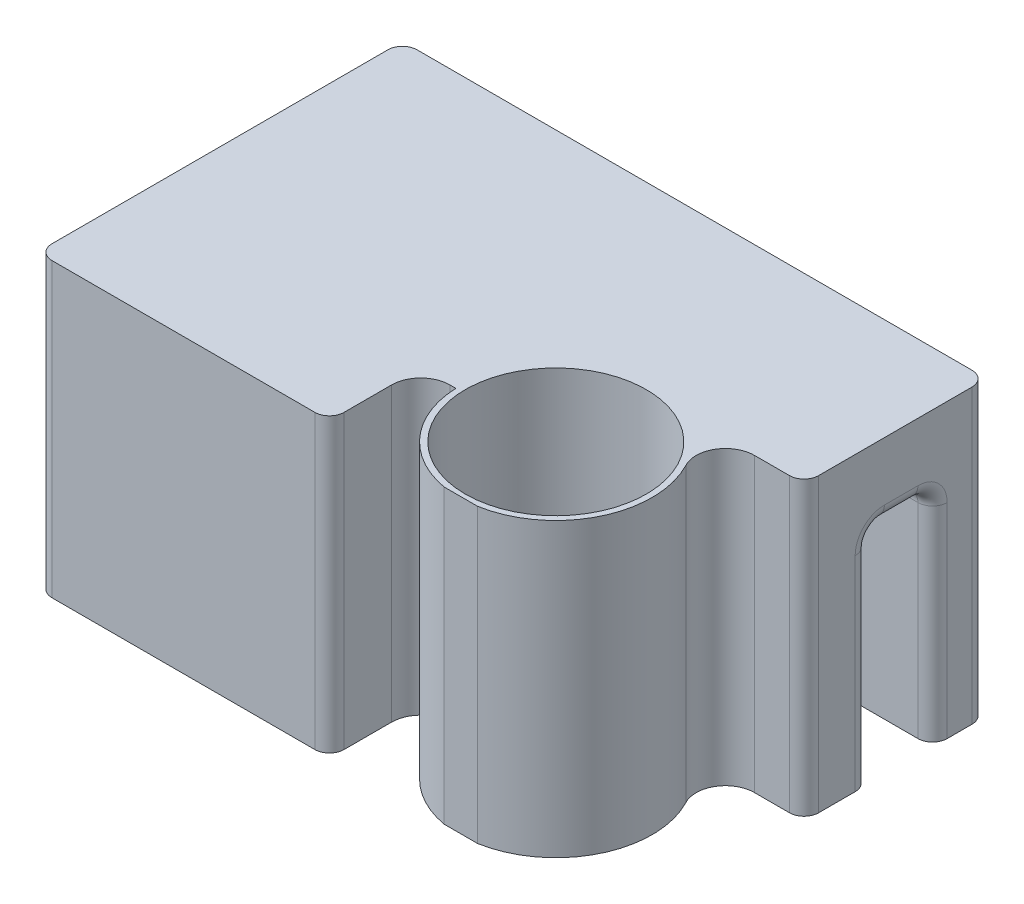
ISO-10303-21;
HEADER;
FILE_DESCRIPTION(('STEP AP214'),'2;1');
FILE_NAME('part.step','',(''),(''),'','','');
FILE_SCHEMA(('AUTOMOTIVE_DESIGN { 1 0 10303 214 1 1 1 1 }'));
ENDSEC;
DATA;
#1=APPLICATION_CONTEXT('core data for automotive mechanical design processes');
#2=APPLICATION_PROTOCOL_DEFINITION('international standard','automotive_design',2000,#1);
#3=PRODUCT_CONTEXT('',#1,'mechanical');
#4=PRODUCT('Part','Part','',(#3));
#5=PRODUCT_RELATED_PRODUCT_CATEGORY('part','',(#4));
#6=PRODUCT_DEFINITION_FORMATION('','',#4);
#7=PRODUCT_DEFINITION_CONTEXT('part definition',#1,'design');
#8=PRODUCT_DEFINITION('design','',#6,#7);
#9=PRODUCT_DEFINITION_SHAPE('','',#8);
#10=(LENGTH_UNIT() NAMED_UNIT(*) SI_UNIT(.MILLI.,.METRE.));
#11=(NAMED_UNIT(*) PLANE_ANGLE_UNIT() SI_UNIT($,.RADIAN.));
#12=(NAMED_UNIT(*) SI_UNIT($,.STERADIAN.) SOLID_ANGLE_UNIT());
#13=UNCERTAINTY_MEASURE_WITH_UNIT(LENGTH_MEASURE(1.E-05),#10,'distance_accuracy_value','');
#14=(GEOMETRIC_REPRESENTATION_CONTEXT(3) GLOBAL_UNCERTAINTY_ASSIGNED_CONTEXT((#13)) GLOBAL_UNIT_ASSIGNED_CONTEXT((#10,
#11,#12)) REPRESENTATION_CONTEXT('',''));
#15=CARTESIAN_POINT('',(0.,0.,0.));
#16=DIRECTION('',(0.,0.,1.));
#17=DIRECTION('',(1.,0.,0.));
#18=AXIS2_PLACEMENT_3D('',#15,#16,#17);
#19=CARTESIAN_POINT('',(20.,20.,12.5));
#20=DIRECTION('',(-1.,0.,0.));
#21=DIRECTION('',(0.,0.,1.));
#22=AXIS2_PLACEMENT_3D('',#19,#20,#21);
#23=PLANE('',#22);
#24=DIRECTION('',(0.,0.,-1.));
#25=VECTOR('',#24,1.);
#26=CARTESIAN_POINT('',(20.,16.,-9.8));
#27=LINE('',#26,#25);
#28=CARTESIAN_POINT('',(20.,16.,-5.5));
#29=VERTEX_POINT('',#28);
#30=CARTESIAN_POINT('',(20.,16.,-7.8));
#31=VERTEX_POINT('',#30);
#32=EDGE_CURVE('E502',#29,#31,#27,.T.);
#33=ORIENTED_EDGE('',*,*,#32,.T.);
#34=CARTESIAN_POINT('',(20.,14.,-7.8));
#35=DIRECTION('',(-1.,0.,0.));
#36=DIRECTION('',(0.,0.,1.));
#37=AXIS2_PLACEMENT_3D('',#34,#35,#36);
#38=CIRCLE('',#37,2.);
#39=CARTESIAN_POINT('',(20.,14.,-9.8));
#40=VERTEX_POINT('',#39);
#41=EDGE_CURVE('E56',#31,#40,#38,.T.);
#42=ORIENTED_EDGE('',*,*,#41,.T.);
#43=DIRECTION('',(0.,-1.,0.));
#44=VECTOR('',#43,1.);
#45=CARTESIAN_POINT('',(20.,20.,-9.8));
#46=LINE('',#45,#44);
#47=CARTESIAN_POINT('',(20.,0.,-9.8));
#48=VERTEX_POINT('',#47);
#49=EDGE_CURVE('E458',#40,#48,#46,.T.);
#50=ORIENTED_EDGE('',*,*,#49,.T.);
#51=DIRECTION('',(0.,0.,-1.));
#52=VECTOR('',#51,1.);
#53=CARTESIAN_POINT('',(20.,0.,12.5));
#54=LINE('',#53,#52);
#55=CARTESIAN_POINT('',(20.,0.,-11.5));
#56=VERTEX_POINT('',#55);
#57=EDGE_CURVE('E322',#48,#56,#54,.T.);
#58=ORIENTED_EDGE('',*,*,#57,.T.);
#59=DIRECTION('',(0.,-1.,0.));
#60=VECTOR('',#59,1.);
#61=CARTESIAN_POINT('',(20.,20.,-11.5));
#62=LINE('',#61,#60);
#63=CARTESIAN_POINT('',(20.,20.,-11.5));
#64=VERTEX_POINT('',#63);
#65=EDGE_CURVE('E460',#56,#64,#62,.F.);
#66=ORIENTED_EDGE('',*,*,#65,.T.);
#67=DIRECTION('',(0.,0.,-1.));
#68=VECTOR('',#67,1.);
#69=CARTESIAN_POINT('',(20.,20.,12.5));
#70=LINE('',#69,#68);
#71=CARTESIAN_POINT('',(20.,20.,-1.));
#72=VERTEX_POINT('',#71);
#73=EDGE_CURVE('E324',#72,#64,#70,.T.);
#74=ORIENTED_EDGE('',*,*,#73,.F.);
#75=DIRECTION('',(0.,1.,0.));
#76=VECTOR('',#75,1.);
#77=CARTESIAN_POINT('',(20.,0.,-1.));
#78=LINE('',#77,#76);
#79=CARTESIAN_POINT('',(20.,0.,-1.));
#80=VERTEX_POINT('',#79);
#81=EDGE_CURVE('E470',#72,#80,#78,.F.);
#82=ORIENTED_EDGE('',*,*,#81,.T.);
#83=CARTESIAN_POINT('',(20.,0.,-3.5));
#84=VERTEX_POINT('',#83);
#85=EDGE_CURVE('E344',#80,#84,#54,.T.);
#86=ORIENTED_EDGE('',*,*,#85,.T.);
#87=DIRECTION('',(0.,-1.,0.));
#88=VECTOR('',#87,1.);
#89=CARTESIAN_POINT('',(20.,20.,-3.5));
#90=LINE('',#89,#88);
#91=CARTESIAN_POINT('',(20.,14.,-3.5));
#92=VERTEX_POINT('',#91);
#93=EDGE_CURVE('E463',#84,#92,#90,.F.);
#94=ORIENTED_EDGE('',*,*,#93,.T.);
#95=CARTESIAN_POINT('',(20.,14.,-5.5));
#96=DIRECTION('',(-1.,0.,0.));
#97=DIRECTION('',(0.,0.,1.));
#98=AXIS2_PLACEMENT_3D('',#95,#96,#97);
#99=CIRCLE('',#98,2.);
#100=EDGE_CURVE('E522',#92,#29,#99,.T.);
#101=ORIENTED_EDGE('',*,*,#100,.T.);
#102=EDGE_LOOP('',(#33,#42,#50,#58,#66,#74,#82,#86,#94,#101));
#103=FACE_BOUND('',#102,.T.);
#104=ADVANCED_FACE('F47',(#103),#23,.F.);
#105=CARTESIAN_POINT('',(-20.,20.,12.5));
#106=DIRECTION('',(0.,0.,-1.));
#107=DIRECTION('',(-1.,0.,0.));
#108=AXIS2_PLACEMENT_3D('',#105,#106,#107);
#109=PLANE('',#108);
#110=DIRECTION('',(0.,1.,0.));
#111=VECTOR('',#110,1.);
#112=CARTESIAN_POINT('',(7.85544768577403,0.,12.5));
#113=LINE('',#112,#111);
#114=CARTESIAN_POINT('',(7.85544768577403,0.,12.5));
#115=VERTEX_POINT('',#114);
#116=CARTESIAN_POINT('',(7.85544768577403,20.,12.5));
#117=VERTEX_POINT('',#116);
#118=EDGE_CURVE('E262',#115,#117,#113,.T.);
#119=ORIENTED_EDGE('',*,*,#118,.F.);
#120=DIRECTION('',(1.,0.,0.));
#121=VECTOR('',#120,1.);
#122=CARTESIAN_POINT('',(-20.,0.,12.5));
#123=LINE('',#122,#121);
#124=CARTESIAN_POINT('',(10.144552314226,0.,12.5));
#125=VERTEX_POINT('',#124);
#126=EDGE_CURVE('E275',#115,#125,#123,.T.);
#127=ORIENTED_EDGE('',*,*,#126,.T.);
#128=DIRECTION('',(0.,1.,0.));
#129=VECTOR('',#128,1.);
#130=CARTESIAN_POINT('',(10.144552314226,0.,12.5));
#131=LINE('',#130,#129);
#132=CARTESIAN_POINT('',(10.144552314226,20.,12.5));
#133=VERTEX_POINT('',#132);
#134=EDGE_CURVE('E284',#125,#133,#131,.T.);
#135=ORIENTED_EDGE('',*,*,#134,.T.);
#136=DIRECTION('',(1.,0.,0.));
#137=VECTOR('',#136,1.);
#138=CARTESIAN_POINT('',(-20.,20.,12.5));
#139=LINE('',#138,#137);
#140=EDGE_CURVE('E338',#117,#133,#139,.T.);
#141=ORIENTED_EDGE('',*,*,#140,.F.);
#142=EDGE_LOOP('',(#119,#127,#135,#141));
#143=FACE_BOUND('',#142,.T.);
#144=ADVANCED_FACE('F596',(#143),#109,.F.);
#145=CARTESIAN_POINT('',(0.,0.,0.));
#146=DIRECTION('',(0.,-1.,0.));
#147=DIRECTION('',(0.,0.,-1.));
#148=AXIS2_PLACEMENT_3D('',#145,#146,#147);
#149=PLANE('',#148);
#150=DIRECTION('',(1.,0.,0.));
#151=VECTOR('',#150,1.);
#152=CARTESIAN_POINT('',(-20.,0.,-8.8));
#153=LINE('',#152,#151);
#154=CARTESIAN_POINT('',(-19.,0.,-8.8));
#155=VERTEX_POINT('',#154);
#156=CARTESIAN_POINT('',(19.,0.,-8.8));
#157=VERTEX_POINT('',#156);
#158=EDGE_CURVE('E311',#155,#157,#153,.T.);
#159=ORIENTED_EDGE('',*,*,#158,.F.);
#160=CARTESIAN_POINT('',(-19.,0.,-9.8));
#161=DIRECTION('',(0.,-1.,0.));
#162=DIRECTION('',(0.,0.,-1.));
#163=AXIS2_PLACEMENT_3D('',#160,#161,#162);
#164=CIRCLE('',#163,1.);
#165=CARTESIAN_POINT('',(-20.,0.,-9.8));
#166=VERTEX_POINT('',#165);
#167=EDGE_CURVE('E397',#155,#166,#164,.T.);
#168=ORIENTED_EDGE('',*,*,#167,.T.);
#169=DIRECTION('',(0.,0.,1.));
#170=VECTOR('',#169,1.);
#171=CARTESIAN_POINT('',(-20.,0.,12.5));
#172=LINE('',#171,#170);
#173=CARTESIAN_POINT('',(-20.,0.,-11.5));
#174=VERTEX_POINT('',#173);
#175=EDGE_CURVE('E358',#174,#166,#172,.T.);
#176=ORIENTED_EDGE('',*,*,#175,.F.);
#177=CARTESIAN_POINT('',(-19.,0.,-11.5));
#178=DIRECTION('',(0.,-1.,0.));
#179=DIRECTION('',(0.,0.,-1.));
#180=AXIS2_PLACEMENT_3D('',#177,#178,#179);
#181=CIRCLE('',#180,1.);
#182=CARTESIAN_POINT('',(-19.,0.,-12.5));
#183=VERTEX_POINT('',#182);
#184=EDGE_CURVE('E392',#174,#183,#181,.T.);
#185=ORIENTED_EDGE('',*,*,#184,.T.);
#186=DIRECTION('',(-1.,0.,0.));
#187=VECTOR('',#186,1.);
#188=CARTESIAN_POINT('',(-20.,0.,-12.5));
#189=LINE('',#188,#187);
#190=CARTESIAN_POINT('',(19.,0.,-12.5));
#191=VERTEX_POINT('',#190);
#192=EDGE_CURVE('E346',#191,#183,#189,.T.);
#193=ORIENTED_EDGE('',*,*,#192,.F.);
#194=CARTESIAN_POINT('',(19.,0.,-11.5));
#195=DIRECTION('',(0.,-1.,0.));
#196=DIRECTION('',(0.,0.,-1.));
#197=AXIS2_PLACEMENT_3D('',#194,#195,#196);
#198=CIRCLE('',#197,1.);
#199=EDGE_CURVE('E394',#191,#56,#198,.T.);
#200=ORIENTED_EDGE('',*,*,#199,.T.);
#201=ORIENTED_EDGE('',*,*,#57,.F.);
#202=CARTESIAN_POINT('',(19.,0.,-9.8));
#203=DIRECTION('',(0.,-1.,0.));
#204=DIRECTION('',(0.,0.,-1.));
#205=AXIS2_PLACEMENT_3D('',#202,#203,#204);
#206=CIRCLE('',#205,1.);
#207=EDGE_CURVE('E400',#48,#157,#206,.T.);
#208=ORIENTED_EDGE('',*,*,#207,.T.);
#209=EDGE_LOOP('',(#159,#168,#176,#185,#193,#200,#201,#208));
#210=FACE_BOUND('',#209,.T.);
#211=ADVANCED_FACE('F582',(#210),#149,.T.);
#212=CARTESIAN_POINT('',(-20.,20.,12.5));
#213=DIRECTION('',(1.,0.,0.));
#214=DIRECTION('',(0.,0.,-1.));
#215=AXIS2_PLACEMENT_3D('',#212,#213,#214);
#216=PLANE('',#215);
#217=DIRECTION('',(0.,0.,1.));
#218=VECTOR('',#217,1.);
#219=CARTESIAN_POINT('',(-20.,16.,-3.5));
#220=LINE('',#219,#218);
#221=CARTESIAN_POINT('',(-20.,16.,-7.8));
#222=VERTEX_POINT('',#221);
#223=CARTESIAN_POINT('',(-20.,16.,-5.50000000000001));
#224=VERTEX_POINT('',#223);
#225=EDGE_CURVE('E68',#222,#224,#220,.T.);
#226=ORIENTED_EDGE('',*,*,#225,.T.);
#227=CARTESIAN_POINT('',(-20.,14.,-5.50000000000001));
#228=DIRECTION('',(1.,0.,0.));
#229=DIRECTION('',(0.,0.,-1.));
#230=AXIS2_PLACEMENT_3D('',#227,#228,#229);
#231=CIRCLE('',#230,2.);
#232=CARTESIAN_POINT('',(-20.,14.,-3.5));
#233=VERTEX_POINT('',#232);
#234=EDGE_CURVE('E12',#224,#233,#231,.T.);
#235=ORIENTED_EDGE('',*,*,#234,.T.);
#236=DIRECTION('',(0.,-1.,0.));
#237=VECTOR('',#236,1.);
#238=CARTESIAN_POINT('',(-20.,20.,-3.5));
#239=LINE('',#238,#237);
#240=CARTESIAN_POINT('',(-20.,0.,-3.5));
#241=VERTEX_POINT('',#240);
#242=EDGE_CURVE('E406',#233,#241,#239,.T.);
#243=ORIENTED_EDGE('',*,*,#242,.T.);
#244=CARTESIAN_POINT('',(-20.,0.,11.5));
#245=VERTEX_POINT('',#244);
#246=EDGE_CURVE('E355',#241,#245,#172,.T.);
#247=ORIENTED_EDGE('',*,*,#246,.T.);
#248=DIRECTION('',(0.,-1.,0.));
#249=VECTOR('',#248,1.);
#250=CARTESIAN_POINT('',(-20.,20.,11.5));
#251=LINE('',#250,#249);
#252=CARTESIAN_POINT('',(-20.,20.,11.5));
#253=VERTEX_POINT('',#252);
#254=EDGE_CURVE('E401',#245,#253,#251,.F.);
#255=ORIENTED_EDGE('',*,*,#254,.T.);
#256=DIRECTION('',(0.,0.,1.));
#257=VECTOR('',#256,1.);
#258=CARTESIAN_POINT('',(-20.,20.,12.5));
#259=LINE('',#258,#257);
#260=CARTESIAN_POINT('',(-20.,20.,-11.5));
#261=VERTEX_POINT('',#260);
#262=EDGE_CURVE('E331',#261,#253,#259,.T.);
#263=ORIENTED_EDGE('',*,*,#262,.F.);
#264=DIRECTION('',(0.,-1.,0.));
#265=VECTOR('',#264,1.);
#266=CARTESIAN_POINT('',(-20.,20.,-11.5));
#267=LINE('',#266,#265);
#268=EDGE_CURVE('E407',#261,#174,#267,.T.);
#269=ORIENTED_EDGE('',*,*,#268,.T.);
#270=ORIENTED_EDGE('',*,*,#175,.T.);
#271=DIRECTION('',(0.,-1.,0.));
#272=VECTOR('',#271,1.);
#273=CARTESIAN_POINT('',(-20.,20.,-9.8));
#274=LINE('',#273,#272);
#275=CARTESIAN_POINT('',(-20.,14.,-9.8));
#276=VERTEX_POINT('',#275);
#277=EDGE_CURVE('E411',#166,#276,#274,.F.);
#278=ORIENTED_EDGE('',*,*,#277,.T.);
#279=CARTESIAN_POINT('',(-20.,14.,-7.8));
#280=DIRECTION('',(1.,0.,0.));
#281=DIRECTION('',(0.,0.,-1.));
#282=AXIS2_PLACEMENT_3D('',#279,#280,#281);
#283=CIRCLE('',#282,2.);
#284=EDGE_CURVE('E72',#276,#222,#283,.T.);
#285=ORIENTED_EDGE('',*,*,#284,.T.);
#286=EDGE_LOOP('',(#226,#235,#243,#247,#255,#263,#269,#270,#278,#285));
#287=FACE_BOUND('',#286,.T.);
#288=ADVANCED_FACE('F629',(#287),#216,.F.);
#289=CARTESIAN_POINT('',(-20.,20.,-12.5));
#290=DIRECTION('',(0.,0.,1.));
#291=DIRECTION('',(1.,0.,0.));
#292=AXIS2_PLACEMENT_3D('',#289,#290,#291);
#293=PLANE('',#292);
#294=DIRECTION('',(-1.,0.,0.));
#295=VECTOR('',#294,1.);
#296=CARTESIAN_POINT('',(-20.,20.,-12.5));
#297=LINE('',#296,#295);
#298=CARTESIAN_POINT('',(19.,20.,-12.5));
#299=VERTEX_POINT('',#298);
#300=CARTESIAN_POINT('',(-19.,20.,-12.5));
#301=VERTEX_POINT('',#300);
#302=EDGE_CURVE('E328',#299,#301,#297,.T.);
#303=ORIENTED_EDGE('',*,*,#302,.F.);
#304=DIRECTION('',(0.,-1.,0.));
#305=VECTOR('',#304,1.);
#306=CARTESIAN_POINT('',(19.,20.,-12.5));
#307=LINE('',#306,#305);
#308=EDGE_CURVE('E471',#299,#191,#307,.T.);
#309=ORIENTED_EDGE('',*,*,#308,.T.);
#310=ORIENTED_EDGE('',*,*,#192,.T.);
#311=DIRECTION('',(0.,-1.,0.));
#312=VECTOR('',#311,1.);
#313=CARTESIAN_POINT('',(-19.,20.,-12.5));
#314=LINE('',#313,#312);
#315=EDGE_CURVE('E467',#183,#301,#314,.F.);
#316=ORIENTED_EDGE('',*,*,#315,.T.);
#317=EDGE_LOOP('',(#303,#309,#310,#316));
#318=FACE_BOUND('',#317,.T.);
#319=ADVANCED_FACE('F625',(#318),#293,.F.);
#320=CARTESIAN_POINT('',(-19.,20.,12.5));
#321=VERTEX_POINT('',#320);
#322=CARTESIAN_POINT('',(-1.,20.,12.5));
#323=VERTEX_POINT('',#322);
#324=EDGE_CURVE('E339',#321,#323,#139,.T.);
#325=ORIENTED_EDGE('',*,*,#324,.F.);
#326=DIRECTION('',(0.,-1.,0.));
#327=VECTOR('',#326,1.);
#328=CARTESIAN_POINT('',(-19.,20.,12.5));
#329=LINE('',#328,#327);
#330=CARTESIAN_POINT('',(-19.,0.,12.5));
#331=VERTEX_POINT('',#330);
#332=EDGE_CURVE('E481',#321,#331,#329,.T.);
#333=ORIENTED_EDGE('',*,*,#332,.T.);
#334=CARTESIAN_POINT('',(-1.,0.,12.5));
#335=VERTEX_POINT('',#334);
#336=EDGE_CURVE('E329',#331,#335,#123,.T.);
#337=ORIENTED_EDGE('',*,*,#336,.T.);
#338=DIRECTION('',(0.,1.,0.));
#339=VECTOR('',#338,1.);
#340=CARTESIAN_POINT('',(-1.,20.,12.5));
#341=LINE('',#340,#339);
#342=EDGE_CURVE('E480',#335,#323,#341,.T.);
#343=ORIENTED_EDGE('',*,*,#342,.T.);
#344=EDGE_LOOP('',(#325,#333,#337,#343));
#345=FACE_BOUND('',#344,.T.);
#346=ADVANCED_FACE('F637',(#345),#109,.F.);
#347=CARTESIAN_POINT('',(0.,20.,0.));
#348=DIRECTION('',(0.,-1.,0.));
#349=DIRECTION('',(0.,0.,-1.));
#350=AXIS2_PLACEMENT_3D('',#347,#348,#349);
#351=PLANE('',#350);
#352=DIRECTION('',(1.,0.,0.));
#353=VECTOR('',#352,1.);
#354=CARTESIAN_POINT('',(0.,20.,0.));
#355=LINE('',#354,#353);
#356=CARTESIAN_POINT('',(16.6131465242697,20.,0.));
#357=VERTEX_POINT('',#356);
#358=CARTESIAN_POINT('',(19.,20.,0.));
#359=VERTEX_POINT('',#358);
#360=EDGE_CURVE('E293',#357,#359,#355,.T.);
#361=ORIENTED_EDGE('',*,*,#360,.T.);
#362=CARTESIAN_POINT('',(19.,20.,-1.));
#363=DIRECTION('',(0.,-1.,0.));
#364=DIRECTION('',(0.,0.,-1.));
#365=AXIS2_PLACEMENT_3D('',#362,#363,#364);
#366=CIRCLE('',#365,1.);
#367=EDGE_CURVE('E454',#359,#72,#366,.F.);
#368=ORIENTED_EDGE('',*,*,#367,.T.);
#369=ORIENTED_EDGE('',*,*,#73,.T.);
#370=CARTESIAN_POINT('',(19.,20.,-11.5));
#371=DIRECTION('',(0.,-1.,0.));
#372=DIRECTION('',(0.,0.,-1.));
#373=AXIS2_PLACEMENT_3D('',#370,#371,#372);
#374=CIRCLE('',#373,1.);
#375=EDGE_CURVE('E453',#64,#299,#374,.F.);
#376=ORIENTED_EDGE('',*,*,#375,.T.);
#377=ORIENTED_EDGE('',*,*,#302,.T.);
#378=CARTESIAN_POINT('',(-19.,20.,-11.5));
#379=DIRECTION('',(0.,-1.,0.));
#380=DIRECTION('',(0.,0.,-1.));
#381=AXIS2_PLACEMENT_3D('',#378,#379,#380);
#382=CIRCLE('',#381,1.);
#383=EDGE_CURVE('E448',#301,#261,#382,.F.);
#384=ORIENTED_EDGE('',*,*,#383,.T.);
#385=ORIENTED_EDGE('',*,*,#262,.T.);
#386=CARTESIAN_POINT('',(-19.,20.,11.5));
#387=DIRECTION('',(0.,-1.,0.));
#388=DIRECTION('',(0.,0.,-1.));
#389=AXIS2_PLACEMENT_3D('',#386,#387,#388);
#390=CIRCLE('',#389,1.);
#391=EDGE_CURVE('E443',#253,#321,#390,.F.);
#392=ORIENTED_EDGE('',*,*,#391,.T.);
#393=ORIENTED_EDGE('',*,*,#324,.T.);
#394=CARTESIAN_POINT('',(-1.,20.,11.5));
#395=DIRECTION('',(0.,-1.,0.));
#396=DIRECTION('',(0.,0.,-1.));
#397=AXIS2_PLACEMENT_3D('',#394,#395,#396);
#398=CIRCLE('',#397,1.);
#399=CARTESIAN_POINT('',(0.,20.,11.5));
#400=VERTEX_POINT('',#399);
#401=EDGE_CURVE('E445',#323,#400,#398,.F.);
#402=ORIENTED_EDGE('',*,*,#401,.T.);
#403=DIRECTION('',(0.,0.,-1.));
#404=VECTOR('',#403,1.);
#405=CARTESIAN_POINT('',(0.,20.,0.));
#406=LINE('',#405,#404);
#407=CARTESIAN_POINT('',(0.,20.,8.25));
#408=VERTEX_POINT('',#407);
#409=EDGE_CURVE('E273',#400,#408,#406,.T.);
#410=ORIENTED_EDGE('',*,*,#409,.T.);
#411=CARTESIAN_POINT('',(2.,20.,8.25));
#412=DIRECTION('',(0.,-1.,0.));
#413=DIRECTION('',(0.,0.,-1.));
#414=AXIS2_PLACEMENT_3D('',#411,#412,#413);
#415=CIRCLE('',#414,2.);
#416=CARTESIAN_POINT('',(2.,20.,6.25));
#417=VERTEX_POINT('',#416);
#418=EDGE_CURVE('E378',#408,#417,#415,.T.);
#419=ORIENTED_EDGE('',*,*,#418,.T.);
#420=DIRECTION('',(1.,0.,0.));
#421=VECTOR('',#420,1.);
#422=CARTESIAN_POINT('',(0.,20.,6.25));
#423=LINE('',#422,#421);
#424=CARTESIAN_POINT('',(2.40473654809756,20.,6.25));
#425=VERTEX_POINT('',#424);
#426=EDGE_CURVE('E280',#417,#425,#423,.T.);
#427=ORIENTED_EDGE('',*,*,#426,.T.);
#428=CARTESIAN_POINT('',(9.,20.,6.));
#429=DIRECTION('',(0.,1.,0.));
#430=DIRECTION('',(0.,0.,1.));
#431=AXIS2_PLACEMENT_3D('',#428,#429,#430);
#432=CIRCLE('',#431,6.6);
#433=EDGE_CURVE('E265',#425,#117,#432,.T.);
#434=ORIENTED_EDGE('',*,*,#433,.T.);
#435=ORIENTED_EDGE('',*,*,#140,.T.);
#436=CARTESIAN_POINT('',(9.,20.,6.));
#437=DIRECTION('',(0.,1.,0.));
#438=DIRECTION('',(0.,0.,1.));
#439=AXIS2_PLACEMENT_3D('',#436,#437,#438);
#440=CIRCLE('',#439,6.6);
#441=CARTESIAN_POINT('',(14.8426473325791,20.,2.93023255813953));
#442=VERTEX_POINT('',#441);
#443=EDGE_CURVE('E299',#133,#442,#440,.T.);
#444=ORIENTED_EDGE('',*,*,#443,.T.);
#445=CARTESIAN_POINT('',(16.6131465242697,20.,2.));
#446=DIRECTION('',(0.,-1.,0.));
#447=DIRECTION('',(0.,0.,-1.));
#448=AXIS2_PLACEMENT_3D('',#445,#446,#447);
#449=CIRCLE('',#448,2.);
#450=EDGE_CURVE('E375',#442,#357,#449,.T.);
#451=ORIENTED_EDGE('',*,*,#450,.T.);
#452=EDGE_LOOP('',(#361,#368,#369,#376,#377,#384,#385,#392,#393,#402,#410,#419,#427,#434,#435,
#444,#451));
#453=FACE_BOUND('',#452,.T.);
#454=CARTESIAN_POINT('',(9.,20.,6.));
#455=DIRECTION('',(0.,1.,0.));
#456=DIRECTION('',(0.,0.,1.));
#457=AXIS2_PLACEMENT_3D('',#454,#455,#456);
#458=CIRCLE('',#457,6.2);
#459=CARTESIAN_POINT('',(9.,20.,12.2));
#460=VERTEX_POINT('',#459);
#461=EDGE_CURVE('E286',#460,#460,#458,.T.);
#462=ORIENTED_EDGE('',*,*,#461,.F.);
#463=EDGE_LOOP('',(#462));
#464=FACE_BOUND('',#463,.T.);
#465=ADVANCED_FACE('F593',(#453,#464),#351,.F.);
#466=ORIENTED_EDGE('',*,*,#246,.F.);
#467=CARTESIAN_POINT('',(-19.,0.,-3.5));
#468=DIRECTION('',(0.,-1.,0.));
#469=DIRECTION('',(0.,0.,-1.));
#470=AXIS2_PLACEMENT_3D('',#467,#468,#469);
#471=CIRCLE('',#470,1.);
#472=CARTESIAN_POINT('',(-19.,0.,-4.50000000000001));
#473=VERTEX_POINT('',#472);
#474=EDGE_CURVE('E428',#241,#473,#471,.T.);
#475=ORIENTED_EDGE('',*,*,#474,.T.);
#476=DIRECTION('',(-1.,0.,0.));
#477=VECTOR('',#476,1.);
#478=CARTESIAN_POINT('',(20.,0.,-4.5));
#479=LINE('',#478,#477);
#480=CARTESIAN_POINT('',(19.,0.,-4.5));
#481=VERTEX_POINT('',#480);
#482=EDGE_CURVE('E319',#481,#473,#479,.T.);
#483=ORIENTED_EDGE('',*,*,#482,.F.);
#484=CARTESIAN_POINT('',(19.,0.,-3.5));
#485=DIRECTION('',(0.,-1.,0.));
#486=DIRECTION('',(0.,0.,-1.));
#487=AXIS2_PLACEMENT_3D('',#484,#485,#486);
#488=CIRCLE('',#487,1.);
#489=EDGE_CURVE('E425',#481,#84,#488,.T.);
#490=ORIENTED_EDGE('',*,*,#489,.T.);
#491=ORIENTED_EDGE('',*,*,#85,.F.);
#492=CARTESIAN_POINT('',(19.,0.,-1.));
#493=DIRECTION('',(0.,-1.,0.));
#494=DIRECTION('',(0.,0.,-1.));
#495=AXIS2_PLACEMENT_3D('',#492,#493,#494);
#496=CIRCLE('',#495,1.);
#497=CARTESIAN_POINT('',(19.,0.,0.));
#498=VERTEX_POINT('',#497);
#499=EDGE_CURVE('E422',#80,#498,#496,.T.);
#500=ORIENTED_EDGE('',*,*,#499,.T.);
#501=DIRECTION('',(1.,0.,0.));
#502=VECTOR('',#501,1.);
#503=CARTESIAN_POINT('',(0.,0.,0.));
#504=LINE('',#503,#502);
#505=CARTESIAN_POINT('',(16.6131465242697,0.,0.));
#506=VERTEX_POINT('',#505);
#507=EDGE_CURVE('E294',#506,#498,#504,.T.);
#508=ORIENTED_EDGE('',*,*,#507,.F.);
#509=CARTESIAN_POINT('',(16.6131465242697,0.,2.));
#510=DIRECTION('',(0.,-1.,0.));
#511=DIRECTION('',(0.,0.,-1.));
#512=AXIS2_PLACEMENT_3D('',#509,#510,#511);
#513=CIRCLE('',#512,2.);
#514=CARTESIAN_POINT('',(14.8426473325791,0.,2.93023255813953));
#515=VERTEX_POINT('',#514);
#516=EDGE_CURVE('E374',#506,#515,#513,.F.);
#517=ORIENTED_EDGE('',*,*,#516,.T.);
#518=CARTESIAN_POINT('',(9.,0.,6.));
#519=DIRECTION('',(0.,1.,0.));
#520=DIRECTION('',(0.,0.,1.));
#521=AXIS2_PLACEMENT_3D('',#518,#519,#520);
#522=CIRCLE('',#521,6.6);
#523=EDGE_CURVE('E287',#125,#515,#522,.T.);
#524=ORIENTED_EDGE('',*,*,#523,.F.);
#525=ORIENTED_EDGE('',*,*,#126,.F.);
#526=CARTESIAN_POINT('',(9.,0.,6.));
#527=DIRECTION('',(0.,1.,0.));
#528=DIRECTION('',(0.,0.,1.));
#529=AXIS2_PLACEMENT_3D('',#526,#527,#528);
#530=CIRCLE('',#529,6.6);
#531=CARTESIAN_POINT('',(2.40473654809756,0.,6.25));
#532=VERTEX_POINT('',#531);
#533=EDGE_CURVE('E258',#532,#115,#530,.T.);
#534=ORIENTED_EDGE('',*,*,#533,.F.);
#535=DIRECTION('',(1.,0.,0.));
#536=VECTOR('',#535,1.);
#537=CARTESIAN_POINT('',(0.,0.,6.25));
#538=LINE('',#537,#536);
#539=CARTESIAN_POINT('',(2.,0.,6.25));
#540=VERTEX_POINT('',#539);
#541=EDGE_CURVE('E245',#540,#532,#538,.T.);
#542=ORIENTED_EDGE('',*,*,#541,.F.);
#543=CARTESIAN_POINT('',(2.,0.,8.25));
#544=DIRECTION('',(0.,-1.,0.));
#545=DIRECTION('',(0.,0.,-1.));
#546=AXIS2_PLACEMENT_3D('',#543,#544,#545);
#547=CIRCLE('',#546,2.);
#548=CARTESIAN_POINT('',(0.,0.,8.25));
#549=VERTEX_POINT('',#548);
#550=EDGE_CURVE('E381',#540,#549,#547,.F.);
#551=ORIENTED_EDGE('',*,*,#550,.T.);
#552=DIRECTION('',(0.,0.,-1.));
#553=VECTOR('',#552,1.);
#554=CARTESIAN_POINT('',(0.,0.,0.));
#555=LINE('',#554,#553);
#556=CARTESIAN_POINT('',(0.,0.,11.5));
#557=VERTEX_POINT('',#556);
#558=EDGE_CURVE('E254',#557,#549,#555,.T.);
#559=ORIENTED_EDGE('',*,*,#558,.F.);
#560=CARTESIAN_POINT('',(-1.,0.,11.5));
#561=DIRECTION('',(0.,-1.,0.));
#562=DIRECTION('',(0.,0.,-1.));
#563=AXIS2_PLACEMENT_3D('',#560,#561,#562);
#564=CIRCLE('',#563,1.);
#565=EDGE_CURVE('E418',#557,#335,#564,.T.);
#566=ORIENTED_EDGE('',*,*,#565,.T.);
#567=ORIENTED_EDGE('',*,*,#336,.F.);
#568=CARTESIAN_POINT('',(-19.,0.,11.5));
#569=DIRECTION('',(0.,-1.,0.));
#570=DIRECTION('',(0.,0.,-1.));
#571=AXIS2_PLACEMENT_3D('',#568,#569,#570);
#572=CIRCLE('',#571,1.);
#573=EDGE_CURVE('E420',#331,#245,#572,.T.);
#574=ORIENTED_EDGE('',*,*,#573,.T.);
#575=EDGE_LOOP('',(#466,#475,#483,#490,#491,#500,#508,#517,#524,#525,#534,#542,#551,#559,#566,
#567,#574));
#576=FACE_BOUND('',#575,.T.);
#577=CARTESIAN_POINT('',(9.,0.,6.));
#578=DIRECTION('',(0.,1.,0.));
#579=DIRECTION('',(0.,0.,1.));
#580=AXIS2_PLACEMENT_3D('',#577,#578,#579);
#581=CIRCLE('',#580,6.2);
#582=CARTESIAN_POINT('',(9.,0.,12.2));
#583=VERTEX_POINT('',#582);
#584=EDGE_CURVE('E310',#583,#583,#581,.T.);
#585=ORIENTED_EDGE('',*,*,#584,.T.);
#586=EDGE_LOOP('',(#585));
#587=FACE_BOUND('',#586,.T.);
#588=ADVANCED_FACE('F268',(#576,#587),#149,.T.);
#589=CARTESIAN_POINT('',(20.,70.2304610960401,-4.5));
#590=DIRECTION('',(0.,0.,1.));
#591=DIRECTION('',(1.,0.,0.));
#592=AXIS2_PLACEMENT_3D('',#589,#590,#591);
#593=PLANE('',#592);
#594=DIRECTION('',(0.,-1.,0.));
#595=VECTOR('',#594,1.);
#596=CARTESIAN_POINT('',(-19.,70.2304610960401,-4.50000000000001));
#597=LINE('',#596,#595);
#598=CARTESIAN_POINT('',(-19.,14.,-4.50000000000001));
#599=VERTEX_POINT('',#598);
#600=EDGE_CURVE('E432',#473,#599,#597,.F.);
#601=ORIENTED_EDGE('',*,*,#600,.T.);
#602=DIRECTION('',(1.,0.,0.));
#603=VECTOR('',#602,1.);
#604=CARTESIAN_POINT('',(20.,14.,-4.5));
#605=LINE('',#604,#603);
#606=CARTESIAN_POINT('',(19.,14.,-4.5));
#607=VERTEX_POINT('',#606);
#608=EDGE_CURVE('E520',#599,#607,#605,.T.);
#609=ORIENTED_EDGE('',*,*,#608,.T.);
#610=DIRECTION('',(0.,-1.,0.));
#611=VECTOR('',#610,1.);
#612=CARTESIAN_POINT('',(19.,70.2304610960401,-4.5));
#613=LINE('',#612,#611);
#614=EDGE_CURVE('E431',#607,#481,#613,.T.);
#615=ORIENTED_EDGE('',*,*,#614,.T.);
#616=ORIENTED_EDGE('',*,*,#482,.T.);
#617=EDGE_LOOP('',(#601,#609,#615,#616));
#618=FACE_BOUND('',#617,.T.);
#619=ADVANCED_FACE('F657',(#618),#593,.F.);
#620=CARTESIAN_POINT('',(-20.,70.2304610960401,-8.8));
#621=DIRECTION('',(0.,0.,-1.));
#622=DIRECTION('',(-1.,0.,0.));
#623=AXIS2_PLACEMENT_3D('',#620,#621,#622);
#624=PLANE('',#623);
#625=DIRECTION('',(0.,-1.,0.));
#626=VECTOR('',#625,1.);
#627=CARTESIAN_POINT('',(19.,70.2304610960401,-8.8));
#628=LINE('',#627,#626);
#629=CARTESIAN_POINT('',(19.,14.,-8.8));
#630=VERTEX_POINT('',#629);
#631=EDGE_CURVE('E383',#157,#630,#628,.F.);
#632=ORIENTED_EDGE('',*,*,#631,.T.);
#633=DIRECTION('',(-1.,0.,0.));
#634=VECTOR('',#633,1.);
#635=CARTESIAN_POINT('',(-20.,14.,-8.8));
#636=LINE('',#635,#634);
#637=CARTESIAN_POINT('',(-19.,14.,-8.8));
#638=VERTEX_POINT('',#637);
#639=EDGE_CURVE('E516',#630,#638,#636,.T.);
#640=ORIENTED_EDGE('',*,*,#639,.T.);
#641=DIRECTION('',(0.,-1.,0.));
#642=VECTOR('',#641,1.);
#643=CARTESIAN_POINT('',(-19.,70.2304610960401,-8.8));
#644=LINE('',#643,#642);
#645=EDGE_CURVE('E389',#638,#155,#644,.T.);
#646=ORIENTED_EDGE('',*,*,#645,.T.);
#647=ORIENTED_EDGE('',*,*,#158,.T.);
#648=EDGE_LOOP('',(#632,#640,#646,#647));
#649=FACE_BOUND('',#648,.T.);
#650=ADVANCED_FACE('F908',(#649),#624,.F.);
#651=CARTESIAN_POINT('',(0.,15.,0.));
#652=DIRECTION('',(0.,-1.,0.));
#653=DIRECTION('',(0.,0.,-1.));
#654=AXIS2_PLACEMENT_3D('',#651,#652,#653);
#655=PLANE('',#654);
#656=DIRECTION('',(-1.,0.,0.));
#657=VECTOR('',#656,1.);
#658=CARTESIAN_POINT('',(0.,15.,-7.8));
#659=LINE('',#658,#657);
#660=CARTESIAN_POINT('',(-19.,15.,-7.8));
#661=VERTEX_POINT('',#660);
#662=CARTESIAN_POINT('',(19.,15.,-7.8));
#663=VERTEX_POINT('',#662);
#664=EDGE_CURVE('E510',#661,#663,#659,.F.);
#665=ORIENTED_EDGE('',*,*,#664,.T.);
#666=DIRECTION('',(0.,0.,-1.));
#667=VECTOR('',#666,1.);
#668=CARTESIAN_POINT('',(19.,15.,-3.5));
#669=LINE('',#668,#667);
#670=CARTESIAN_POINT('',(19.,15.,-5.5));
#671=VERTEX_POINT('',#670);
#672=EDGE_CURVE('E511',#663,#671,#669,.F.);
#673=ORIENTED_EDGE('',*,*,#672,.T.);
#674=DIRECTION('',(1.,0.,0.));
#675=VECTOR('',#674,1.);
#676=CARTESIAN_POINT('',(0.,15.,-5.5));
#677=LINE('',#676,#675);
#678=CARTESIAN_POINT('',(-19.,15.,-5.50000000000001));
#679=VERTEX_POINT('',#678);
#680=EDGE_CURVE('E507',#671,#679,#677,.F.);
#681=ORIENTED_EDGE('',*,*,#680,.T.);
#682=DIRECTION('',(0.,0.,1.));
#683=VECTOR('',#682,1.);
#684=CARTESIAN_POINT('',(-19.,15.,-9.8));
#685=LINE('',#684,#683);
#686=EDGE_CURVE('E504',#679,#661,#685,.F.);
#687=ORIENTED_EDGE('',*,*,#686,.T.);
#688=EDGE_LOOP('',(#665,#673,#681,#687));
#689=FACE_BOUND('',#688,.T.);
#690=ADVANCED_FACE('F679',(#689),#655,.T.);
#691=CARTESIAN_POINT('',(9.,0.,6.));
#692=DIRECTION('',(0.,1.,0.));
#693=DIRECTION('',(0.,0.,1.));
#694=AXIS2_PLACEMENT_3D('',#691,#692,#693);
#695=CYLINDRICAL_SURFACE('',#694,6.2);
#696=ORIENTED_EDGE('',*,*,#584,.F.);
#697=EDGE_LOOP('',(#696));
#698=FACE_BOUND('',#697,.T.);
#699=ORIENTED_EDGE('',*,*,#461,.T.);
#700=EDGE_LOOP('',(#699));
#701=FACE_BOUND('',#700,.T.);
#702=ADVANCED_FACE('F879',(#698,#701),#695,.F.);
#703=CARTESIAN_POINT('',(9.,0.,6.));
#704=DIRECTION('',(0.,1.,0.));
#705=DIRECTION('',(0.,0.,1.));
#706=AXIS2_PLACEMENT_3D('',#703,#704,#705);
#707=CYLINDRICAL_SURFACE('',#706,6.6);
#708=ORIENTED_EDGE('',*,*,#433,.F.);
#709=DIRECTION('',(0.,1.,0.));
#710=VECTOR('',#709,1.);
#711=CARTESIAN_POINT('',(2.40473654809756,0.,6.25));
#712=LINE('',#711,#710);
#713=EDGE_CURVE('E248',#532,#425,#712,.T.);
#714=ORIENTED_EDGE('',*,*,#713,.F.);
#715=ORIENTED_EDGE('',*,*,#533,.T.);
#716=ORIENTED_EDGE('',*,*,#118,.T.);
#717=EDGE_LOOP('',(#708,#714,#715,#716));
#718=FACE_BOUND('',#717,.T.);
#719=ADVANCED_FACE('F259',(#718),#707,.T.);
#720=CARTESIAN_POINT('',(0.,0.,0.));
#721=DIRECTION('',(1.,0.,0.));
#722=DIRECTION('',(0.,0.,-1.));
#723=AXIS2_PLACEMENT_3D('',#720,#721,#722);
#724=PLANE('',#723);
#725=ORIENTED_EDGE('',*,*,#409,.F.);
#726=DIRECTION('',(0.,1.,0.));
#727=VECTOR('',#726,1.);
#728=CARTESIAN_POINT('',(0.,0.,11.5));
#729=LINE('',#728,#727);
#730=EDGE_CURVE('E484',#400,#557,#729,.F.);
#731=ORIENTED_EDGE('',*,*,#730,.T.);
#732=ORIENTED_EDGE('',*,*,#558,.T.);
#733=DIRECTION('',(0.,1.,0.));
#734=VECTOR('',#733,1.);
#735=CARTESIAN_POINT('',(0.,20.,8.25));
#736=LINE('',#735,#734);
#737=EDGE_CURVE('E368',#549,#408,#736,.T.);
#738=ORIENTED_EDGE('',*,*,#737,.T.);
#739=EDGE_LOOP('',(#725,#731,#732,#738));
#740=FACE_BOUND('',#739,.T.);
#741=ADVANCED_FACE('F650',(#740),#724,.T.);
#742=CARTESIAN_POINT('',(0.,0.,6.25));
#743=DIRECTION('',(0.,0.,1.));
#744=DIRECTION('',(1.,0.,0.));
#745=AXIS2_PLACEMENT_3D('',#742,#743,#744);
#746=PLANE('',#745);
#747=ORIENTED_EDGE('',*,*,#426,.F.);
#748=DIRECTION('',(0.,1.,0.));
#749=VECTOR('',#748,1.);
#750=CARTESIAN_POINT('',(2.,0.,6.25));
#751=LINE('',#750,#749);
#752=EDGE_CURVE('E249',#417,#540,#751,.F.);
#753=ORIENTED_EDGE('',*,*,#752,.T.);
#754=ORIENTED_EDGE('',*,*,#541,.T.);
#755=ORIENTED_EDGE('',*,*,#713,.T.);
#756=EDGE_LOOP('',(#747,#753,#754,#755));
#757=FACE_BOUND('',#756,.T.);
#758=ADVANCED_FACE('F241',(#757),#746,.T.);
#759=CARTESIAN_POINT('',(9.,0.,6.));
#760=DIRECTION('',(0.,1.,0.));
#761=DIRECTION('',(0.,0.,1.));
#762=AXIS2_PLACEMENT_3D('',#759,#760,#761);
#763=CYLINDRICAL_SURFACE('',#762,6.6);
#764=ORIENTED_EDGE('',*,*,#523,.T.);
#765=DIRECTION('',(0.,1.,0.));
#766=VECTOR('',#765,1.);
#767=CARTESIAN_POINT('',(14.8426473325791,0.,2.93023255813953));
#768=LINE('',#767,#766);
#769=EDGE_CURVE('E341',#515,#442,#768,.T.);
#770=ORIENTED_EDGE('',*,*,#769,.T.);
#771=ORIENTED_EDGE('',*,*,#443,.F.);
#772=ORIENTED_EDGE('',*,*,#134,.F.);
#773=EDGE_LOOP('',(#764,#770,#771,#772));
#774=FACE_BOUND('',#773,.T.);
#775=ADVANCED_FACE('F598',(#774),#763,.T.);
#776=CARTESIAN_POINT('',(0.,0.,0.));
#777=DIRECTION('',(0.,0.,1.));
#778=DIRECTION('',(1.,0.,0.));
#779=AXIS2_PLACEMENT_3D('',#776,#777,#778);
#780=PLANE('',#779);
#781=ORIENTED_EDGE('',*,*,#507,.T.);
#782=DIRECTION('',(0.,1.,0.));
#783=VECTOR('',#782,1.);
#784=CARTESIAN_POINT('',(19.,20.,0.));
#785=LINE('',#784,#783);
#786=EDGE_CURVE('E437',#498,#359,#785,.T.);
#787=ORIENTED_EDGE('',*,*,#786,.T.);
#788=ORIENTED_EDGE('',*,*,#360,.F.);
#789=DIRECTION('',(0.,-1.,0.));
#790=VECTOR('',#789,1.);
#791=CARTESIAN_POINT('',(16.6131465242697,0.,0.));
#792=LINE('',#791,#790);
#793=EDGE_CURVE('E361',#357,#506,#792,.T.);
#794=ORIENTED_EDGE('',*,*,#793,.T.);
#795=EDGE_LOOP('',(#781,#787,#788,#794));
#796=FACE_BOUND('',#795,.T.);
#797=ADVANCED_FACE('F610',(#796),#780,.T.);
#798=CARTESIAN_POINT('',(16.6131465242697,0.,2.));
#799=DIRECTION('',(0.,1.,0.));
#800=DIRECTION('',(0.,0.,1.));
#801=AXIS2_PLACEMENT_3D('',#798,#799,#800);
#802=CYLINDRICAL_SURFACE('',#801,2.);
#803=ORIENTED_EDGE('',*,*,#516,.F.);
#804=ORIENTED_EDGE('',*,*,#793,.F.);
#805=ORIENTED_EDGE('',*,*,#450,.F.);
#806=ORIENTED_EDGE('',*,*,#769,.F.);
#807=EDGE_LOOP('',(#803,#804,#805,#806));
#808=FACE_BOUND('',#807,.T.);
#809=ADVANCED_FACE('F603',(#808),#802,.F.);
#810=CARTESIAN_POINT('',(2.,0.,8.25));
#811=DIRECTION('',(0.,-1.,0.));
#812=DIRECTION('',(0.,0.,-1.));
#813=AXIS2_PLACEMENT_3D('',#810,#811,#812);
#814=CYLINDRICAL_SURFACE('',#813,2.);
#815=ORIENTED_EDGE('',*,*,#550,.F.);
#816=ORIENTED_EDGE('',*,*,#752,.F.);
#817=ORIENTED_EDGE('',*,*,#418,.F.);
#818=ORIENTED_EDGE('',*,*,#737,.F.);
#819=EDGE_LOOP('',(#815,#816,#817,#818));
#820=FACE_BOUND('',#819,.T.);
#821=ADVANCED_FACE('F651',(#820),#814,.F.);
#822=CARTESIAN_POINT('',(-19.,70.2304610960401,-9.8));
#823=DIRECTION('',(0.,-1.,0.));
#824=DIRECTION('',(0.,0.,-1.));
#825=AXIS2_PLACEMENT_3D('',#822,#823,#824);
#826=CYLINDRICAL_SURFACE('',#825,1.);
#827=ORIENTED_EDGE('',*,*,#645,.F.);
#828=CARTESIAN_POINT('',(-19.,14.,-9.8));
#829=DIRECTION('',(0.,-1.,0.));
#830=DIRECTION('',(0.,0.,-1.));
#831=AXIS2_PLACEMENT_3D('',#828,#829,#830);
#832=CIRCLE('',#831,1.);
#833=EDGE_CURVE('E499',#638,#276,#832,.T.);
#834=ORIENTED_EDGE('',*,*,#833,.T.);
#835=ORIENTED_EDGE('',*,*,#277,.F.);
#836=ORIENTED_EDGE('',*,*,#167,.F.);
#837=EDGE_LOOP('',(#827,#834,#835,#836));
#838=FACE_BOUND('',#837,.T.);
#839=ADVANCED_FACE('F711',(#838),#826,.T.);
#840=CARTESIAN_POINT('',(-19.,20.,-3.5));
#841=DIRECTION('',(0.,-1.,0.));
#842=DIRECTION('',(0.,0.,-1.));
#843=AXIS2_PLACEMENT_3D('',#840,#841,#842);
#844=CYLINDRICAL_SURFACE('',#843,1.);
#845=ORIENTED_EDGE('',*,*,#242,.F.);
#846=CARTESIAN_POINT('',(-19.,14.,-3.5));
#847=DIRECTION('',(0.,-1.,0.));
#848=DIRECTION('',(0.,0.,-1.));
#849=AXIS2_PLACEMENT_3D('',#846,#847,#848);
#850=CIRCLE('',#849,1.);
#851=EDGE_CURVE('E488',#233,#599,#850,.T.);
#852=ORIENTED_EDGE('',*,*,#851,.T.);
#853=ORIENTED_EDGE('',*,*,#600,.F.);
#854=ORIENTED_EDGE('',*,*,#474,.F.);
#855=EDGE_LOOP('',(#845,#852,#853,#854));
#856=FACE_BOUND('',#855,.T.);
#857=ADVANCED_FACE('F662',(#856),#844,.T.);
#858=CARTESIAN_POINT('',(19.,0.,-1.));
#859=DIRECTION('',(0.,-1.,0.));
#860=DIRECTION('',(0.,0.,-1.));
#861=AXIS2_PLACEMENT_3D('',#858,#859,#860);
#862=CYLINDRICAL_SURFACE('',#861,1.);
#863=ORIENTED_EDGE('',*,*,#499,.F.);
#864=ORIENTED_EDGE('',*,*,#81,.F.);
#865=ORIENTED_EDGE('',*,*,#367,.F.);
#866=ORIENTED_EDGE('',*,*,#786,.F.);
#867=EDGE_LOOP('',(#863,#864,#865,#866));
#868=FACE_BOUND('',#867,.T.);
#869=ADVANCED_FACE('F612',(#868),#862,.T.);
#870=CARTESIAN_POINT('',(19.,70.2304610960401,-3.5));
#871=DIRECTION('',(0.,-1.,0.));
#872=DIRECTION('',(0.,0.,-1.));
#873=AXIS2_PLACEMENT_3D('',#870,#871,#872);
#874=CYLINDRICAL_SURFACE('',#873,1.);
#875=ORIENTED_EDGE('',*,*,#614,.F.);
#876=CARTESIAN_POINT('',(19.,14.,-3.5));
#877=DIRECTION('',(0.,-1.,0.));
#878=DIRECTION('',(0.,0.,-1.));
#879=AXIS2_PLACEMENT_3D('',#876,#877,#878);
#880=CIRCLE('',#879,1.);
#881=EDGE_CURVE('E495',#607,#92,#880,.T.);
#882=ORIENTED_EDGE('',*,*,#881,.T.);
#883=ORIENTED_EDGE('',*,*,#93,.F.);
#884=ORIENTED_EDGE('',*,*,#489,.F.);
#885=EDGE_LOOP('',(#875,#882,#883,#884));
#886=FACE_BOUND('',#885,.T.);
#887=ADVANCED_FACE('F671',(#886),#874,.T.);
#888=CARTESIAN_POINT('',(19.,20.,-9.8));
#889=DIRECTION('',(0.,-1.,0.));
#890=DIRECTION('',(0.,0.,-1.));
#891=AXIS2_PLACEMENT_3D('',#888,#889,#890);
#892=CYLINDRICAL_SURFACE('',#891,1.);
#893=ORIENTED_EDGE('',*,*,#49,.F.);
#894=CARTESIAN_POINT('',(19.,14.,-9.8));
#895=DIRECTION('',(0.,-1.,0.));
#896=DIRECTION('',(0.,0.,-1.));
#897=AXIS2_PLACEMENT_3D('',#894,#895,#896);
#898=CIRCLE('',#897,1.);
#899=EDGE_CURVE('E494',#40,#630,#898,.T.);
#900=ORIENTED_EDGE('',*,*,#899,.T.);
#901=ORIENTED_EDGE('',*,*,#631,.F.);
#902=ORIENTED_EDGE('',*,*,#207,.F.);
#903=EDGE_LOOP('',(#893,#900,#901,#902));
#904=FACE_BOUND('',#903,.T.);
#905=ADVANCED_FACE('F580',(#904),#892,.T.);
#906=CARTESIAN_POINT('',(19.,20.,-11.5));
#907=DIRECTION('',(0.,-1.,0.));
#908=DIRECTION('',(0.,0.,-1.));
#909=AXIS2_PLACEMENT_3D('',#906,#907,#908);
#910=CYLINDRICAL_SURFACE('',#909,1.);
#911=ORIENTED_EDGE('',*,*,#375,.F.);
#912=ORIENTED_EDGE('',*,*,#65,.F.);
#913=ORIENTED_EDGE('',*,*,#199,.F.);
#914=ORIENTED_EDGE('',*,*,#308,.F.);
#915=EDGE_LOOP('',(#911,#912,#913,#914));
#916=FACE_BOUND('',#915,.T.);
#917=ADVANCED_FACE('F620',(#916),#910,.T.);
#918=CARTESIAN_POINT('',(-19.,20.,-11.5));
#919=DIRECTION('',(0.,-1.,0.));
#920=DIRECTION('',(0.,0.,-1.));
#921=AXIS2_PLACEMENT_3D('',#918,#919,#920);
#922=CYLINDRICAL_SURFACE('',#921,1.);
#923=ORIENTED_EDGE('',*,*,#383,.F.);
#924=ORIENTED_EDGE('',*,*,#315,.F.);
#925=ORIENTED_EDGE('',*,*,#184,.F.);
#926=ORIENTED_EDGE('',*,*,#268,.F.);
#927=EDGE_LOOP('',(#923,#924,#925,#926));
#928=FACE_BOUND('',#927,.T.);
#929=ADVANCED_FACE('F623',(#928),#922,.T.);
#930=CARTESIAN_POINT('',(-19.,20.,11.5));
#931=DIRECTION('',(0.,-1.,0.));
#932=DIRECTION('',(0.,0.,-1.));
#933=AXIS2_PLACEMENT_3D('',#930,#931,#932);
#934=CYLINDRICAL_SURFACE('',#933,1.);
#935=ORIENTED_EDGE('',*,*,#391,.F.);
#936=ORIENTED_EDGE('',*,*,#254,.F.);
#937=ORIENTED_EDGE('',*,*,#573,.F.);
#938=ORIENTED_EDGE('',*,*,#332,.F.);
#939=EDGE_LOOP('',(#935,#936,#937,#938));
#940=FACE_BOUND('',#939,.T.);
#941=ADVANCED_FACE('F631',(#940),#934,.T.);
#942=CARTESIAN_POINT('',(-1.,20.,11.5));
#943=DIRECTION('',(0.,-1.,0.));
#944=DIRECTION('',(0.,0.,-1.));
#945=AXIS2_PLACEMENT_3D('',#942,#943,#944);
#946=CYLINDRICAL_SURFACE('',#945,1.);
#947=ORIENTED_EDGE('',*,*,#565,.F.);
#948=ORIENTED_EDGE('',*,*,#730,.F.);
#949=ORIENTED_EDGE('',*,*,#401,.F.);
#950=ORIENTED_EDGE('',*,*,#342,.F.);
#951=EDGE_LOOP('',(#947,#948,#949,#950));
#952=FACE_BOUND('',#951,.T.);
#953=ADVANCED_FACE('F645',(#952),#946,.T.);
#954=CARTESIAN_POINT('',(19.,14.,-7.8));
#955=DIRECTION('',(-1.,0.,0.));
#956=DIRECTION('',(0.,0.,1.));
#957=AXIS2_PLACEMENT_3D('',#954,#955,#956);
#958=TOROIDAL_SURFACE('',#957,2.,1.);
#959=ORIENTED_EDGE('',*,*,#899,.F.);
#960=ORIENTED_EDGE('',*,*,#41,.F.);
#961=CARTESIAN_POINT('',(19.,16.,-7.8));
#962=DIRECTION('',(0.,0.,-1.));
#963=DIRECTION('',(-1.,0.,0.));
#964=AXIS2_PLACEMENT_3D('',#961,#962,#963);
#965=CIRCLE('',#964,1.);
#966=EDGE_CURVE('E52',#663,#31,#965,.F.);
#967=ORIENTED_EDGE('',*,*,#966,.F.);
#968=CARTESIAN_POINT('',(19.,14.,-7.8));
#969=DIRECTION('',(-1.,0.,0.));
#970=DIRECTION('',(0.,0.,1.));
#971=AXIS2_PLACEMENT_3D('',#968,#969,#970);
#972=CIRCLE('',#971,1.);
#973=EDGE_CURVE('E551',#630,#663,#972,.F.);
#974=ORIENTED_EDGE('',*,*,#973,.F.);
#975=EDGE_LOOP('',(#959,#960,#967,#974));
#976=FACE_BOUND('',#975,.T.);
#977=ADVANCED_FACE('F51',(#976),#958,.T.);
#978=CARTESIAN_POINT('',(19.,16.,12.5));
#979=DIRECTION('',(0.,0.,1.));
#980=DIRECTION('',(1.,0.,0.));
#981=AXIS2_PLACEMENT_3D('',#978,#979,#980);
#982=CYLINDRICAL_SURFACE('',#981,1.);
#983=ORIENTED_EDGE('',*,*,#966,.T.);
#984=ORIENTED_EDGE('',*,*,#32,.F.);
#985=CARTESIAN_POINT('',(19.,16.,-5.5));
#986=DIRECTION('',(0.,0.,1.));
#987=DIRECTION('',(1.,0.,0.));
#988=AXIS2_PLACEMENT_3D('',#985,#986,#987);
#989=CIRCLE('',#988,1.);
#990=EDGE_CURVE('E552',#671,#29,#989,.T.);
#991=ORIENTED_EDGE('',*,*,#990,.F.);
#992=ORIENTED_EDGE('',*,*,#672,.F.);
#993=EDGE_LOOP('',(#983,#984,#991,#992));
#994=FACE_BOUND('',#993,.T.);
#995=ADVANCED_FACE('F570',(#994),#982,.T.);
#996=CARTESIAN_POINT('',(-20.,14.,-7.8));
#997=DIRECTION('',(-1.,0.,0.));
#998=DIRECTION('',(0.,0.,1.));
#999=AXIS2_PLACEMENT_3D('',#996,#997,#998);
#1000=CYLINDRICAL_SURFACE('',#999,1.);
#1001=ORIENTED_EDGE('',*,*,#973,.T.);
#1002=ORIENTED_EDGE('',*,*,#664,.F.);
#1003=CARTESIAN_POINT('',(-19.,14.,-7.8));
#1004=DIRECTION('',(1.,0.,0.));
#1005=DIRECTION('',(0.,0.,-1.));
#1006=AXIS2_PLACEMENT_3D('',#1003,#1004,#1005);
#1007=CIRCLE('',#1006,1.);
#1008=EDGE_CURVE('E550',#638,#661,#1007,.T.);
#1009=ORIENTED_EDGE('',*,*,#1008,.F.);
#1010=ORIENTED_EDGE('',*,*,#639,.F.);
#1011=EDGE_LOOP('',(#1001,#1002,#1009,#1010));
#1012=FACE_BOUND('',#1011,.T.);
#1013=ADVANCED_FACE('F685',(#1012),#1000,.F.);
#1014=CARTESIAN_POINT('',(19.,14.,-5.5));
#1015=DIRECTION('',(-1.,0.,0.));
#1016=DIRECTION('',(0.,0.,1.));
#1017=AXIS2_PLACEMENT_3D('',#1014,#1015,#1016);
#1018=TOROIDAL_SURFACE('',#1017,2.,1.);
#1019=ORIENTED_EDGE('',*,*,#100,.F.);
#1020=ORIENTED_EDGE('',*,*,#881,.F.);
#1021=CARTESIAN_POINT('',(19.,14.,-5.5));
#1022=DIRECTION('',(-1.,0.,0.));
#1023=DIRECTION('',(0.,0.,1.));
#1024=AXIS2_PLACEMENT_3D('',#1021,#1022,#1023);
#1025=CIRCLE('',#1024,1.);
#1026=EDGE_CURVE('E543',#671,#607,#1025,.F.);
#1027=ORIENTED_EDGE('',*,*,#1026,.F.);
#1028=ORIENTED_EDGE('',*,*,#990,.T.);
#1029=EDGE_LOOP('',(#1019,#1020,#1027,#1028));
#1030=FACE_BOUND('',#1029,.T.);
#1031=ADVANCED_FACE('F680',(#1030),#1018,.T.);
#1032=CARTESIAN_POINT('',(-19.,14.,-7.8));
#1033=DIRECTION('',(1.,0.,0.));
#1034=DIRECTION('',(0.,0.,-1.));
#1035=AXIS2_PLACEMENT_3D('',#1032,#1033,#1034);
#1036=TOROIDAL_SURFACE('',#1035,2.,1.);
#1037=ORIENTED_EDGE('',*,*,#833,.F.);
#1038=ORIENTED_EDGE('',*,*,#1008,.T.);
#1039=CARTESIAN_POINT('',(-19.,16.,-7.8));
#1040=DIRECTION('',(0.,0.,-1.));
#1041=DIRECTION('',(-1.,0.,0.));
#1042=AXIS2_PLACEMENT_3D('',#1039,#1040,#1041);
#1043=CIRCLE('',#1042,1.);
#1044=EDGE_CURVE('E537',#222,#661,#1043,.F.);
#1045=ORIENTED_EDGE('',*,*,#1044,.F.);
#1046=ORIENTED_EDGE('',*,*,#284,.F.);
#1047=EDGE_LOOP('',(#1037,#1038,#1045,#1046));
#1048=FACE_BOUND('',#1047,.T.);
#1049=ADVANCED_FACE('F681',(#1048),#1036,.T.);
#1050=CARTESIAN_POINT('',(20.,14.,-5.5));
#1051=DIRECTION('',(1.,0.,0.));
#1052=DIRECTION('',(0.,0.,-1.));
#1053=AXIS2_PLACEMENT_3D('',#1050,#1051,#1052);
#1054=CYLINDRICAL_SURFACE('',#1053,1.);
#1055=ORIENTED_EDGE('',*,*,#1026,.T.);
#1056=ORIENTED_EDGE('',*,*,#608,.F.);
#1057=CARTESIAN_POINT('',(-19.,14.,-5.50000000000001));
#1058=DIRECTION('',(1.,0.,0.));
#1059=DIRECTION('',(0.,0.,-1.));
#1060=AXIS2_PLACEMENT_3D('',#1057,#1058,#1059);
#1061=CIRCLE('',#1060,1.);
#1062=EDGE_CURVE('E536',#679,#599,#1061,.T.);
#1063=ORIENTED_EDGE('',*,*,#1062,.F.);
#1064=ORIENTED_EDGE('',*,*,#680,.F.);
#1065=EDGE_LOOP('',(#1055,#1056,#1063,#1064));
#1066=FACE_BOUND('',#1065,.T.);
#1067=ADVANCED_FACE('F669',(#1066),#1054,.F.);
#1068=CARTESIAN_POINT('',(-19.,16.,12.5));
#1069=DIRECTION('',(0.,0.,-1.));
#1070=DIRECTION('',(-1.,0.,0.));
#1071=AXIS2_PLACEMENT_3D('',#1068,#1069,#1070);
#1072=CYLINDRICAL_SURFACE('',#1071,1.);
#1073=ORIENTED_EDGE('',*,*,#1044,.T.);
#1074=ORIENTED_EDGE('',*,*,#686,.F.);
#1075=CARTESIAN_POINT('',(-19.,16.,-5.50000000000001));
#1076=DIRECTION('',(0.,0.,1.));
#1077=DIRECTION('',(1.,0.,0.));
#1078=AXIS2_PLACEMENT_3D('',#1075,#1076,#1077);
#1079=CIRCLE('',#1078,1.);
#1080=EDGE_CURVE('E535',#224,#679,#1079,.T.);
#1081=ORIENTED_EDGE('',*,*,#1080,.F.);
#1082=ORIENTED_EDGE('',*,*,#225,.F.);
#1083=EDGE_LOOP('',(#1073,#1074,#1081,#1082));
#1084=FACE_BOUND('',#1083,.T.);
#1085=ADVANCED_FACE('F690',(#1084),#1072,.T.);
#1086=CARTESIAN_POINT('',(-19.,14.,-5.50000000000001));
#1087=DIRECTION('',(1.,0.,0.));
#1088=DIRECTION('',(0.,0.,-1.));
#1089=AXIS2_PLACEMENT_3D('',#1086,#1087,#1088);
#1090=TOROIDAL_SURFACE('',#1089,2.,1.);
#1091=ORIENTED_EDGE('',*,*,#851,.F.);
#1092=ORIENTED_EDGE('',*,*,#234,.F.);
#1093=ORIENTED_EDGE('',*,*,#1080,.T.);
#1094=ORIENTED_EDGE('',*,*,#1062,.T.);
#1095=EDGE_LOOP('',(#1091,#1092,#1093,#1094));
#1096=FACE_BOUND('',#1095,.T.);
#1097=ADVANCED_FACE('F663',(#1096),#1090,.T.);
#1098=CLOSED_SHELL('',(#104,#144,#211,#288,#319,#346,#465,#588,#619,#650,#690,#702,#719,#741,
#758,#775,#797,#809,#821,#839,#857,#869,#887,#905,#917,#929,#941,#953,#977,#995,#1013,#1031,
#1049,#1067,#1085,#1097));
#1099=MANIFOLD_SOLID_BREP('B2',#1098);
#1100=ADVANCED_BREP_SHAPE_REPRESENTATION('',(#18,#1099),#14);
#1101=SHAPE_DEFINITION_REPRESENTATION(#9,#1100);
ENDSEC;
END-ISO-10303-21;
